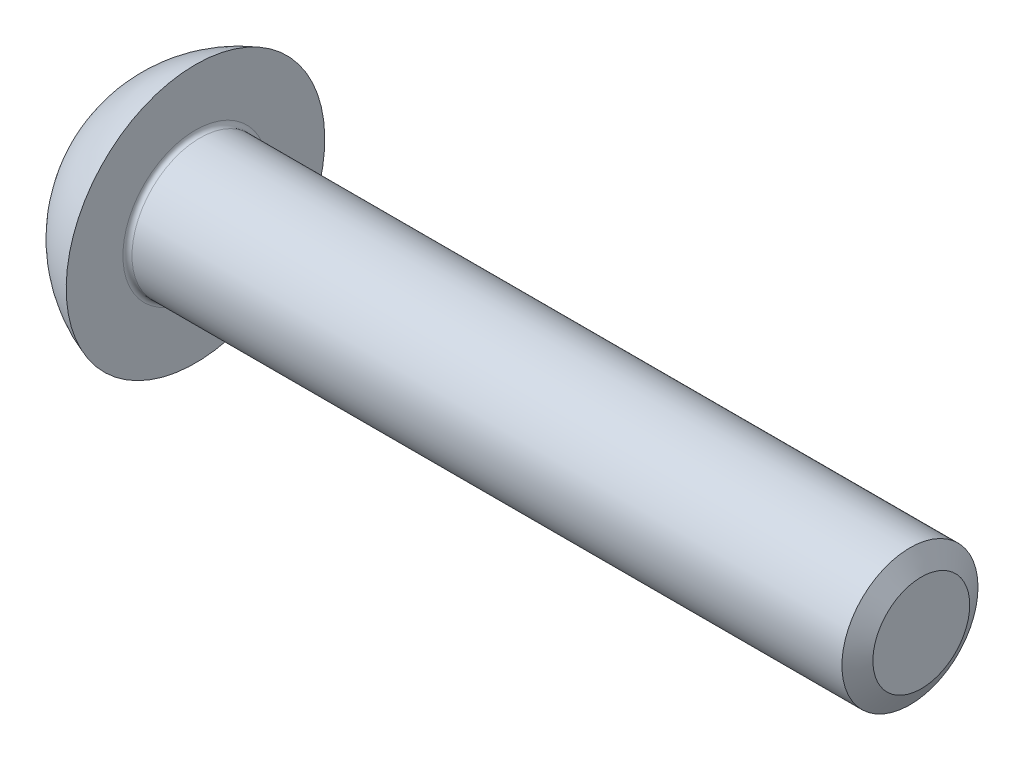
ISO-10303-21;
HEADER;
FILE_DESCRIPTION(('STEP AP214'),'2;1');
FILE_NAME('part.step','',(''),(''),'','','');
FILE_SCHEMA(('AUTOMOTIVE_DESIGN { 1 0 10303 214 1 1 1 1 }'));
ENDSEC;
DATA;
#1=APPLICATION_CONTEXT('core data for automotive mechanical design processes');
#2=APPLICATION_PROTOCOL_DEFINITION('international standard','automotive_design',2000,#1);
#3=PRODUCT_CONTEXT('',#1,'mechanical');
#4=PRODUCT('Part','Part','',(#3));
#5=PRODUCT_RELATED_PRODUCT_CATEGORY('part','',(#4));
#6=PRODUCT_DEFINITION_FORMATION('','',#4);
#7=PRODUCT_DEFINITION_CONTEXT('part definition',#1,'design');
#8=PRODUCT_DEFINITION('design','',#6,#7);
#9=PRODUCT_DEFINITION_SHAPE('','',#8);
#10=(LENGTH_UNIT() NAMED_UNIT(*) SI_UNIT(.MILLI.,.METRE.));
#11=(NAMED_UNIT(*) PLANE_ANGLE_UNIT() SI_UNIT($,.RADIAN.));
#12=(NAMED_UNIT(*) SI_UNIT($,.STERADIAN.) SOLID_ANGLE_UNIT());
#13=UNCERTAINTY_MEASURE_WITH_UNIT(LENGTH_MEASURE(1.E-05),#10,'distance_accuracy_value','');
#14=(GEOMETRIC_REPRESENTATION_CONTEXT(3) GLOBAL_UNCERTAINTY_ASSIGNED_CONTEXT((#13)) GLOBAL_UNIT_ASSIGNED_CONTEXT((#10,
#11,#12)) REPRESENTATION_CONTEXT('',''));
#15=CARTESIAN_POINT('',(0.,0.,0.));
#16=DIRECTION('',(0.,0.,1.));
#17=DIRECTION('',(1.,0.,0.));
#18=AXIS2_PLACEMENT_3D('',#15,#16,#17);
#19=CARTESIAN_POINT('',(-17.65,0.,0.));
#20=DIRECTION('',(-1.,0.,0.));
#21=DIRECTION('',(0.,0.,-1.));
#22=AXIS2_PLACEMENT_3D('',#19,#20,#21);
#23=CYLINDRICAL_SURFACE('',#22,1.5);
#24=CARTESIAN_POINT('',(-15.9,0.,0.));
#25=DIRECTION('',(1.,0.,0.));
#26=DIRECTION('',(0.,0.,-1.));
#27=AXIS2_PLACEMENT_3D('',#24,#25,#26);
#28=CIRCLE('',#27,1.5);
#29=CARTESIAN_POINT('',(-15.9,0.,-1.5));
#30=VERTEX_POINT('',#29);
#31=EDGE_CURVE('E185',#30,#30,#28,.T.);
#32=ORIENTED_EDGE('',*,*,#31,.T.);
#33=EDGE_LOOP('',(#32));
#34=FACE_BOUND('',#33,.T.);
#35=CARTESIAN_POINT('',(-0.25,0.,0.));
#36=DIRECTION('',(1.,0.,0.));
#37=DIRECTION('',(0.,0.,-1.));
#38=AXIS2_PLACEMENT_3D('',#35,#36,#37);
#39=CIRCLE('',#38,1.5);
#40=CARTESIAN_POINT('',(-0.25,0.,-1.5));
#41=VERTEX_POINT('',#40);
#42=EDGE_CURVE('E458',#41,#41,#39,.T.);
#43=ORIENTED_EDGE('',*,*,#42,.F.);
#44=EDGE_LOOP('',(#43));
#45=FACE_BOUND('',#44,.T.);
#46=ADVANCED_FACE('F43',(#34,#45),#23,.T.);
#47=CARTESIAN_POINT('',(-17.65,0.,0.));
#48=DIRECTION('',(1.,0.,0.));
#49=DIRECTION('',(0.,0.,1.));
#50=AXIS2_PLACEMENT_3D('',#47,#48,#49);
#51=PLANE('',#50);
#52=CARTESIAN_POINT('',(-17.65,0.,0.));
#53=DIRECTION('',(1.,0.,0.));
#54=DIRECTION('',(0.,0.,-1.));
#55=AXIS2_PLACEMENT_3D('',#52,#53,#54);
#56=CIRCLE('',#55,1.5);
#57=CARTESIAN_POINT('',(-17.65,1.5,0.));
#58=VERTEX_POINT('',#57);
#59=EDGE_CURVE('E177',#58,#58,#56,.T.);
#60=ORIENTED_EDGE('',*,*,#59,.F.);
#61=EDGE_LOOP('',(#60));
#62=FACE_BOUND('',#61,.T.);
#63=CARTESIAN_POINT('',(-17.65,0.,0.));
#64=DIRECTION('',(-1.,0.,0.));
#65=DIRECTION('',(0.,0.,1.));
#66=AXIS2_PLACEMENT_3D('',#63,#64,#65);
#67=CIRCLE('',#66,1.15470053837925);
#68=CARTESIAN_POINT('',(-17.65,-0.577350269189627,1.));
#69=VERTEX_POINT('',#68);
#70=CARTESIAN_POINT('',(-17.65,-1.15470053837925,0.));
#71=VERTEX_POINT('',#70);
#72=EDGE_CURVE('E11',#69,#71,#67,.F.);
#73=ORIENTED_EDGE('',*,*,#72,.T.);
#74=CARTESIAN_POINT('',(-17.65,-0.577350269189633,-0.999999999999999));
#75=VERTEX_POINT('',#74);
#76=EDGE_CURVE('E52',#71,#75,#67,.F.);
#77=ORIENTED_EDGE('',*,*,#76,.T.);
#78=CARTESIAN_POINT('',(-17.65,0.577350269189629,-1.));
#79=VERTEX_POINT('',#78);
#80=EDGE_CURVE('E294',#75,#79,#67,.F.);
#81=ORIENTED_EDGE('',*,*,#80,.T.);
#82=CARTESIAN_POINT('',(-17.65,0.,0.));
#83=DIRECTION('',(1.,0.,0.));
#84=DIRECTION('',(0.,0.,-1.));
#85=AXIS2_PLACEMENT_3D('',#82,#83,#84);
#86=CIRCLE('',#85,1.15470053837925);
#87=CARTESIAN_POINT('',(-17.65,1.15470053837925,0.));
#88=VERTEX_POINT('',#87);
#89=EDGE_CURVE('E212',#79,#88,#86,.T.);
#90=ORIENTED_EDGE('',*,*,#89,.T.);
#91=CARTESIAN_POINT('',(-17.65,0.577350269189628,1.));
#92=VERTEX_POINT('',#91);
#93=EDGE_CURVE('E128',#88,#92,#67,.F.);
#94=ORIENTED_EDGE('',*,*,#93,.T.);
#95=EDGE_CURVE('E47',#92,#69,#67,.F.);
#96=ORIENTED_EDGE('',*,*,#95,.T.);
#97=EDGE_LOOP('',(#73,#77,#81,#90,#94,#96));
#98=FACE_BOUND('',#97,.T.);
#99=ADVANCED_FACE('F45',(#62,#98),#51,.F.);
#100=CARTESIAN_POINT('',(-15.0454545454545,0.,0.));
#101=DIRECTION('',(-1.,0.,0.));
#102=DIRECTION('',(0.,1.,0.));
#103=AXIS2_PLACEMENT_3D('',#100,#101,#102);
#104=SPHERICAL_SURFACE('',#103,3.00560426949281);
#105=CARTESIAN_POINT('',(-16.,0.,0.));
#106=DIRECTION('',(1.,0.,0.));
#107=DIRECTION('',(0.,0.,-1.));
#108=AXIS2_PLACEMENT_3D('',#105,#106,#107);
#109=CIRCLE('',#108,2.85);
#110=CARTESIAN_POINT('',(-16.,2.85,0.));
#111=VERTEX_POINT('',#110);
#112=EDGE_CURVE('E180',#111,#111,#109,.T.);
#113=CARTESIAN_POINT('',(-17.65,1.5,0.));
#114=CARTESIAN_POINT('',(-17.6386705331495,1.51967216925547,0.));
#115=CARTESIAN_POINT('',(-17.6271181108235,1.53921593268643,0.));
#116=CARTESIAN_POINT('',(-17.6035734644196,1.57803672196104,0.));
#117=CARTESIAN_POINT('',(-17.5915812403415,1.59731374780468,0.));
#118=CARTESIAN_POINT('',(-17.5671630996322,1.6355911359664,0.));
#119=CARTESIAN_POINT('',(-17.554737183001,1.65459149828446,0.));
#120=CARTESIAN_POINT('',(-17.5294580495481,1.69230581219271,0.));
#121=CARTESIAN_POINT('',(-17.5166048327265,1.71101976378289,0.));
#122=CARTESIAN_POINT('',(-17.4904776944242,1.74815164624667,0.));
#123=CARTESIAN_POINT('',(-17.4772037729434,1.76656957712026,0.));
#124=CARTESIAN_POINT('',(-17.4502420411911,1.8030999627764,0.));
#125=CARTESIAN_POINT('',(-17.4365542309196,1.82121241755894,0.));
#126=CARTESIAN_POINT('',(-17.4087717487848,1.85712255178676,0.));
#127=CARTESIAN_POINT('',(-17.3946770769215,1.87492023123203,0.));
#128=CARTESIAN_POINT('',(-17.366088108,1.91019167733672,0.));
#129=CARTESIAN_POINT('',(-17.3515938109419,1.92766544399613,0.));
#130=CARTESIAN_POINT('',(-17.3222130331156,1.96228009332959,0.));
#131=CARTESIAN_POINT('',(-17.3073265523475,1.97942097600362,0.));
#132=CARTESIAN_POINT('',(-17.2771690499588,2.01336105708599,0.));
#133=CARTESIAN_POINT('',(-17.2618980283382,2.03016025549433,0.));
#134=CARTESIAN_POINT('',(-17.2309792845233,2.06340834318511,0.));
#135=CARTESIAN_POINT('',(-17.2153315623289,2.07985723246755,0.));
#136=CARTESIAN_POINT('',(-17.1836674510477,2.1123962568992,0.));
#137=CARTESIAN_POINT('',(-17.1676510619609,2.12848639204841,0.));
#138=CARTESIAN_POINT('',(-17.1352578398529,2.16029964739354,0.));
#139=CARTESIAN_POINT('',(-17.1188810068317,2.17602276758948,0.));
#140=CARTESIAN_POINT('',(-17.0857753048683,2.2070939206369,0.));
#141=CARTESIAN_POINT('',(-17.069046435926,2.22244195348838,0.));
#142=CARTESIAN_POINT('',(-17.0352452508718,2.25275505202893,0.));
#143=CARTESIAN_POINT('',(-17.01817293476,2.26772011771798,0.));
#144=CARTESIAN_POINT('',(-16.9836936204474,2.29725959873447,0.));
#145=CARTESIAN_POINT('',(-16.9662866222466,2.3118340140619,0.));
#146=CARTESIAN_POINT('',(-16.9311468806653,2.34058471171934,0.));
#147=CARTESIAN_POINT('',(-16.9134141372848,2.35476099404935,0.));
#148=CARTESIAN_POINT('',(-16.8776320094939,2.38270814748122,0.));
#149=CARTESIAN_POINT('',(-16.8595826250834,2.39647901858308,0.));
#150=CARTESIAN_POINT('',(-16.8231764819488,2.42360827946967,0.));
#151=CARTESIAN_POINT('',(-16.8048197232246,2.43696666925441,0.));
#152=CARTESIAN_POINT('',(-16.7678082559874,2.46326410918943,0.));
#153=CARTESIAN_POINT('',(-16.7491535474743,2.4762031593397,0.));
#154=CARTESIAN_POINT('',(-16.7115557581542,2.50165527698115,0.));
#155=CARTESIAN_POINT('',(-16.6926126773472,2.51416834447231,0.));
#156=CARTESIAN_POINT('',(-16.6544478689872,2.53876207247436,0.));
#157=CARTESIAN_POINT('',(-16.6352261414343,2.55084273298523,0.));
#158=CARTESIAN_POINT('',(-16.5965139081898,2.57456544470665,0.));
#159=CARTESIAN_POINT('',(-16.5770234024984,2.5862074959172,0.));
#160=CARTESIAN_POINT('',(-16.5377836195783,2.60904701190565,0.));
#161=CARTESIAN_POINT('',(-16.5180343423497,2.62024447668356,0.));
#162=CARTESIAN_POINT('',(-16.4782871558097,2.6421890709225,0.));
#163=CARTESIAN_POINT('',(-16.4582892464984,2.65293620038352,0.));
#164=CARTESIAN_POINT('',(-16.4180550629064,2.67397460633529,0.));
#165=CARTESIAN_POINT('',(-16.3978187886257,2.68426588282603,0.));
#166=CARTESIAN_POINT('',(-16.3571182645539,2.70438729913089,0.));
#167=CARTESIAN_POINT('',(-16.3366540147628,2.714217438945,0.));
#168=CARTESIAN_POINT('',(-16.2955080462974,2.73341153528513,0.));
#169=CARTESIAN_POINT('',(-16.2748263276231,2.74277549181114,0.));
#170=CARTESIAN_POINT('',(-16.2332560392077,2.7610324130256,0.));
#171=CARTESIAN_POINT('',(-16.2123674694665,2.76992537771404,0.));
#172=CARTESIAN_POINT('',(-16.1703942046549,2.78723575329491,0.));
#173=CARTESIAN_POINT('',(-16.1493095095844,2.79565316418733,0.));
#174=CARTESIAN_POINT('',(-16.1069548141172,2.81200809653372,0.));
#175=CARTESIAN_POINT('',(-16.0856848137203,2.8199456179877,0.));
#176=CARTESIAN_POINT('',(-16.0429704467276,2.83533674876495,0.));
#177=CARTESIAN_POINT('',(-16.0215260801317,2.84279035808822,0.));
#178=CARTESIAN_POINT('',(-16.,2.85,0.));
#179=B_SPLINE_CURVE_WITH_KNOTS('',3,(#113,#114,#115,#116,#117,#118,#119,#120,#121,#122,#123,
#124,#125,#126,#127,#128,#129,#130,#131,#132,#133,#134,#135,#136,#137,#138,#139,#140,#141,#142,
#143,#144,#145,#146,#147,#148,#149,#150,#151,#152,#153,#154,#155,#156,#157,#158,#159,#160,#161,
#162,#163,#164,#165,#166,#167,#168,#169,#170,#171,#172,#173,#174,#175,#176,#177,#178),
.UNSPECIFIED.,.F.,.F.,(4,2,2,2,2,2,2,2,2,2,2,2,2,2,2,2,2,2,2,2,2,2,2,2,2,2,2,2,2,2,2,2,4),(0.,
0.0681025747754081,0.136205149550819,0.204307724326227,0.272410299101637,0.340512873877048,
0.408615448652458,0.476718023427867,0.544820598203276,0.612923172978687,0.681025747754097,
0.749128322529505,0.817230897304915,0.885333472080324,0.953436046855735,1.02153862163114,
1.08964119640655,1.15774377118196,1.22584634595737,1.29394892073278,1.36205149550819,
1.4301540702836,1.49825664505901,1.56635921983442,1.63446179460983,1.70256436938524,
1.77066694416065,1.83876951893606,1.90687209371147,1.97497466848688,2.04307724326229,
2.1111798180377,2.17928239281311),.UNSPECIFIED.);
#180=EDGE_CURVE('BSEAM156',#58,#111,#179,.T.);
#181=ORIENTED_EDGE('',*,*,#59,.T.);
#182=ORIENTED_EDGE('',*,*,#112,.F.);
#183=ORIENTED_EDGE('',*,*,#180,.T.);
#184=ORIENTED_EDGE('',*,*,#180,.F.);
#185=EDGE_LOOP('',(#181,#183,#182,#184));
#186=FACE_BOUND('',#185,.T.);
#187=ADVANCED_FACE('F156',(#186),#104,.T.);
#188=CARTESIAN_POINT('',(-16.,1.6,0.));
#189=DIRECTION('',(-1.,0.,0.));
#190=DIRECTION('',(0.,0.,-1.));
#191=AXIS2_PLACEMENT_3D('',#188,#189,#190);
#192=PLANE('',#191);
#193=ORIENTED_EDGE('',*,*,#112,.T.);
#194=EDGE_LOOP('',(#193));
#195=FACE_BOUND('',#194,.T.);
#196=CARTESIAN_POINT('',(-16.,0.,0.));
#197=DIRECTION('',(1.,0.,0.));
#198=DIRECTION('',(0.,0.,-1.));
#199=AXIS2_PLACEMENT_3D('',#196,#197,#198);
#200=CIRCLE('',#199,1.6);
#201=CARTESIAN_POINT('',(-16.,0.,-1.6));
#202=VERTEX_POINT('',#201);
#203=EDGE_CURVE('E181',#202,#202,#200,.T.);
#204=ORIENTED_EDGE('',*,*,#203,.F.);
#205=EDGE_LOOP('',(#204));
#206=FACE_BOUND('',#205,.T.);
#207=ADVANCED_FACE('F166',(#195,#206),#192,.F.);
#208=CARTESIAN_POINT('',(-15.9,0.,0.));
#209=DIRECTION('',(-1.,0.,0.));
#210=DIRECTION('',(0.,0.,-1.));
#211=AXIS2_PLACEMENT_3D('',#208,#209,#210);
#212=TOROIDAL_SURFACE('',#211,1.6,0.0999999999999997);
#213=ORIENTED_EDGE('',*,*,#203,.T.);
#214=EDGE_LOOP('',(#213));
#215=FACE_BOUND('',#214,.T.);
#216=ORIENTED_EDGE('',*,*,#31,.F.);
#217=EDGE_LOOP('',(#216));
#218=FACE_BOUND('',#217,.T.);
#219=ADVANCED_FACE('F149',(#215,#218),#212,.F.);
#220=CARTESIAN_POINT('',(-17.35,0.,0.));
#221=DIRECTION('',(-1.,0.,0.));
#222=DIRECTION('',(0.,0.,-1.));
#223=AXIS2_PLACEMENT_3D('',#220,#221,#222);
#224=CONICAL_SURFACE('',#223,0.,1.31660847419538);
#225=CARTESIAN_POINT('',(-17.8201338061757,-1.5081300450323,1.));
#226=CARTESIAN_POINT('',(-17.8103550434582,-1.46296169551438,1.));
#227=CARTESIAN_POINT('',(-17.8007010634319,-1.41776633015547,1.));
#228=CARTESIAN_POINT('',(-17.7817057249496,-1.32730802004725,1.));
#229=CARTESIAN_POINT('',(-17.7723643798043,-1.28204507250605,1.));
#230=CARTESIAN_POINT('',(-17.744887707109,-1.1460540932135,1.));
#231=CARTESIAN_POINT('',(-17.727318593487,-1.05520983554783,1.));
#232=CARTESIAN_POINT('',(-17.6946113120355,-0.873838301527069,1.));
#233=CARTESIAN_POINT('',(-17.6794545669183,-0.783314439111169,1.));
#234=CARTESIAN_POINT('',(-17.6526000869216,-0.601754544937859,1.));
#235=CARTESIAN_POINT('',(-17.6409016960468,-0.510718613654572,1.));
#236=CARTESIAN_POINT('',(-17.6224688104588,-0.327147289363391,1.));
#237=CARTESIAN_POINT('',(-17.615787761882,-0.23460619153087,1.));
#238=CARTESIAN_POINT('',(-17.6090368362792,-0.0493046546038947,1.));
#239=CARTESIAN_POINT('',(-17.6089640024594,0.0434556678202297,1.));
#240=CARTESIAN_POINT('',(-17.6154534933963,0.229083736297403,1.));
#241=CARTESIAN_POINT('',(-17.6220414736928,0.321950510989406,1.));
#242=CARTESIAN_POINT('',(-17.6404572139866,0.507192547661315,1.));
#243=CARTESIAN_POINT('',(-17.6522884816114,0.599567438647759,1.));
#244=CARTESIAN_POINT('',(-17.6798118313046,0.785811374344468,1.));
#245=CARTESIAN_POINT('',(-17.6955836030667,0.87966821099882,1.));
#246=CARTESIAN_POINT('',(-17.7295232966728,1.06695285350417,1.));
#247=CARTESIAN_POINT('',(-17.7476915787193,1.16038059267177,1.));
#248=CARTESIAN_POINT('',(-17.7855853163011,1.34694314919725,1.));
#249=CARTESIAN_POINT('',(-17.8053112029702,1.44007787798178,1.));
#250=CARTESIAN_POINT('',(-17.8457971322914,1.62612272763755,1.));
#251=CARTESIAN_POINT('',(-17.866557196056,1.71903284388273,1.));
#252=CARTESIAN_POINT('',(-17.9085485742601,1.90363742744431,1.));
#253=CARTESIAN_POINT('',(-17.9297718689088,1.99533372655925,1.));
#254=CARTESIAN_POINT('',(-17.9727143057913,2.17861191601366,1.));
#255=CARTESIAN_POINT('',(-17.9944334585808,2.27019380387372,1.));
#256=CARTESIAN_POINT('',(-18.0382042420233,2.45314970796373,1.));
#257=CARTESIAN_POINT('',(-18.0602553943374,2.54452383886908,1.));
#258=CARTESIAN_POINT('',(-18.1046332471854,2.72720190599483,1.));
#259=CARTESIAN_POINT('',(-18.1269599382911,2.8185058445041,1.));
#260=CARTESIAN_POINT('',(-18.1493826695211,2.9097859214388,1.));
#261=B_SPLINE_CURVE_WITH_KNOTS('',3,(#225,#226,#227,#228,#229,#230,#231,#232,#233,#234,#235,
#236,#237,#238,#239,#240,#241,#242,#243,#244,#245,#246,#247,#248,#249,#250,#251,#252,#253,#254,
#255,#256,#257,#258,#259,#260),.UNSPECIFIED.,.F.,.F.,(4,2,2,2,2,2,2,2,2,2,2,2,2,2,2,2,2,4),(0.,
0.138643869889783,0.277293635233151,0.554857004517541,0.830167022781704,1.10542478551794,
1.38357462934897,1.66160001660695,1.94070037269331,2.21998772241579,2.50545939030144,
2.79097401441239,3.07656794584651,3.36216771000261,3.64452690710852,3.92689212062334,
4.20888343548738,4.49086512790397),.UNSPECIFIED.);
#262=EDGE_CURVE('E105',#69,#92,#261,.T.);
#263=ORIENTED_EDGE('',*,*,#262,.F.);
#264=ORIENTED_EDGE('',*,*,#95,.F.);
#265=EDGE_LOOP('',(#263,#264));
#266=FACE_BOUND('',#265,.T.);
#267=ADVANCED_FACE('F120',(#266),#224,.F.);
#268=CARTESIAN_POINT('',(-17.6500300044995,0.57723479913579,1.0002));
#269=CARTESIAN_POINT('',(-17.6437929192042,0.601225021738601,0.958647715567044));
#270=CARTESIAN_POINT('',(-17.6381313786167,0.625256195021443,0.917024502475672));
#271=CARTESIAN_POINT('',(-17.6281854217223,0.673398386330441,0.833639781140785));
#272=CARTESIAN_POINT('',(-17.6239015302713,0.697509431260086,0.791878226299064));
#273=CARTESIAN_POINT('',(-17.6169589031667,0.745673772514857,0.708455140132715));
#274=CARTESIAN_POINT('',(-17.6142923745456,0.769726780462719,0.66679410829216));
#275=CARTESIAN_POINT('',(-17.6107168929941,0.817861664223351,0.583422044002323));
#276=CARTESIAN_POINT('',(-17.6098076211353,0.841943534003896,0.541711022001162));
#277=CARTESIAN_POINT('',(-17.6098076211353,0.890107273564986,0.458288977998839));
#278=CARTESIAN_POINT('',(-17.6107168929941,0.914189143345531,0.416577955997678));
#279=CARTESIAN_POINT('',(-17.6142923745456,0.962324027106163,0.333205891707841));
#280=CARTESIAN_POINT('',(-17.6169589031667,0.986377035054025,0.291544859867286));
#281=CARTESIAN_POINT('',(-17.6239015302713,1.0345413763088,0.208121773700937));
#282=CARTESIAN_POINT('',(-17.6281854217223,1.05865242123844,0.166360218859216));
#283=CARTESIAN_POINT('',(-17.6381313786167,1.10679461254744,0.0829754975243296));
#284=CARTESIAN_POINT('',(-17.6437929192042,1.13082578583028,0.0413522844329569));
#285=CARTESIAN_POINT('',(-17.6500300044996,1.15481600843309,-0.000199999999998983));
#286=B_SPLINE_CURVE_WITH_KNOTS('',3,(#268,#269,#270,#271,#272,#273,#274,#275,#276,#277,#278,
#279,#280,#281,#282,#283,#284,#285),.UNSPECIFIED.,.F.,.F.,(4,2,2,2,2,2,2,2,4),(0.,
0.145159524820138,0.290374287087485,0.434883682122849,0.57936684736763,0.723850012612412,
0.868359407647777,1.01357416991512,1.15873369473526),.UNSPECIFIED.);
#287=EDGE_CURVE('E122',#92,#88,#286,.T.);
#288=ORIENTED_EDGE('',*,*,#287,.F.);
#289=ORIENTED_EDGE('',*,*,#93,.F.);
#290=EDGE_LOOP('',(#288,#289));
#291=FACE_BOUND('',#290,.T.);
#292=ADVANCED_FACE('F148',(#291),#224,.F.);
#293=CARTESIAN_POINT('',(-17.6500300044996,1.15481600843309,0.000200000000000797));
#294=CARTESIAN_POINT('',(-17.6437929192042,1.13082578583028,-0.0413522844329552));
#295=CARTESIAN_POINT('',(-17.6381313786167,1.10679461254744,-0.0829754975243279));
#296=CARTESIAN_POINT('',(-17.6281854217223,1.05865242123844,-0.166360218859215));
#297=CARTESIAN_POINT('',(-17.6239015302713,1.0345413763088,-0.208121773700935));
#298=CARTESIAN_POINT('',(-17.6169589031667,0.986377035054025,-0.291544859867285));
#299=CARTESIAN_POINT('',(-17.6142923745456,0.962324027106163,-0.33320589170784));
#300=CARTESIAN_POINT('',(-17.6107168929941,0.914189143345531,-0.416577955997676));
#301=CARTESIAN_POINT('',(-17.6098076211353,0.890107273564986,-0.458288977998838));
#302=CARTESIAN_POINT('',(-17.6098076211353,0.841943534003896,-0.541711022001161));
#303=CARTESIAN_POINT('',(-17.6107168929941,0.817861664223351,-0.583422044002322));
#304=CARTESIAN_POINT('',(-17.6142923745456,0.769726780462719,-0.666794108292158));
#305=CARTESIAN_POINT('',(-17.6169589031667,0.745673772514857,-0.708455140132713));
#306=CARTESIAN_POINT('',(-17.6239015302713,0.697509431260086,-0.791878226299063));
#307=CARTESIAN_POINT('',(-17.6281854217223,0.673398386330441,-0.833639781140783));
#308=CARTESIAN_POINT('',(-17.6381313786167,0.625256195021442,-0.91702450247567));
#309=CARTESIAN_POINT('',(-17.6437929192042,0.601225021738601,-0.958647715567043));
#310=CARTESIAN_POINT('',(-17.6500300044995,0.57723479913579,-1.0002));
#311=B_SPLINE_CURVE_WITH_KNOTS('',3,(#293,#294,#295,#296,#297,#298,#299,#300,#301,#302,#303,
#304,#305,#306,#307,#308,#309,#310),.UNSPECIFIED.,.F.,.F.,(4,2,2,2,2,2,2,2,4),(0.,
0.145159524820137,0.290374287087485,0.43488368212285,0.579366847367631,0.723850012612412,
0.868359407647777,1.01357416991512,1.15873369473526),.UNSPECIFIED.);
#312=EDGE_CURVE('E277',#88,#79,#311,.T.);
#313=ORIENTED_EDGE('',*,*,#312,.F.);
#314=ORIENTED_EDGE('',*,*,#89,.F.);
#315=EDGE_LOOP('',(#313,#314));
#316=FACE_BOUND('',#315,.T.);
#317=ADVANCED_FACE('F144',(#316),#224,.F.);
#318=CARTESIAN_POINT('',(-17.8201338061757,-1.5081300450323,-0.999999999999999));
#319=CARTESIAN_POINT('',(-17.8103550434582,-1.46296169551439,-0.999999999999999));
#320=CARTESIAN_POINT('',(-17.8007010634319,-1.41776633015547,-0.999999999999999));
#321=CARTESIAN_POINT('',(-17.7817057249496,-1.32730802004725,-0.999999999999999));
#322=CARTESIAN_POINT('',(-17.7723643798043,-1.28204507250605,-0.999999999999999));
#323=CARTESIAN_POINT('',(-17.744887707109,-1.1460540932135,-0.999999999999999));
#324=CARTESIAN_POINT('',(-17.727318593487,-1.05520983554783,-0.999999999999999));
#325=CARTESIAN_POINT('',(-17.6946113120355,-0.87383830152707,-0.999999999999999));
#326=CARTESIAN_POINT('',(-17.6794545669183,-0.78331443911117,-0.999999999999999));
#327=CARTESIAN_POINT('',(-17.6526000869216,-0.601754544937859,-0.999999999999999));
#328=CARTESIAN_POINT('',(-17.6409016960468,-0.510718613654572,-0.999999999999999));
#329=CARTESIAN_POINT('',(-17.6224688104588,-0.327147289363391,-0.999999999999999));
#330=CARTESIAN_POINT('',(-17.615787761882,-0.23460619153087,-0.999999999999999));
#331=CARTESIAN_POINT('',(-17.6090368362792,-0.049304654603895,-0.999999999999999));
#332=CARTESIAN_POINT('',(-17.6089640024594,0.0434556678202295,-0.999999999999999));
#333=CARTESIAN_POINT('',(-17.6154534933963,0.229083736297403,-0.999999999999999));
#334=CARTESIAN_POINT('',(-17.6220414736928,0.321950510989406,-0.999999999999999));
#335=CARTESIAN_POINT('',(-17.6404572139866,0.507192547661315,-0.999999999999999));
#336=CARTESIAN_POINT('',(-17.6522884816114,0.599567438647759,-0.999999999999999));
#337=CARTESIAN_POINT('',(-17.6798118313046,0.785811374344468,-0.999999999999999));
#338=CARTESIAN_POINT('',(-17.6955836030667,0.879668210998819,-0.999999999999999));
#339=CARTESIAN_POINT('',(-17.7295232966728,1.06695285350416,-0.999999999999999));
#340=CARTESIAN_POINT('',(-17.7476915787193,1.16038059267177,-0.999999999999999));
#341=CARTESIAN_POINT('',(-17.7855853163011,1.34694314919725,-0.999999999999999));
#342=CARTESIAN_POINT('',(-17.8053112029702,1.44007787798178,-0.999999999999999));
#343=CARTESIAN_POINT('',(-17.8457971322914,1.62612272763755,-0.999999999999999));
#344=CARTESIAN_POINT('',(-17.866557196056,1.71903284388273,-0.999999999999999));
#345=CARTESIAN_POINT('',(-17.9085485742601,1.90363742744431,-0.999999999999999));
#346=CARTESIAN_POINT('',(-17.9297718689088,1.99533372655925,-0.999999999999999));
#347=CARTESIAN_POINT('',(-17.9727143057913,2.17861191601366,-0.999999999999999));
#348=CARTESIAN_POINT('',(-17.9944334585808,2.27019380387372,-0.999999999999999));
#349=CARTESIAN_POINT('',(-18.0382042420233,2.45314970796373,-0.999999999999999));
#350=CARTESIAN_POINT('',(-18.0602553943374,2.54452383886908,-0.999999999999999));
#351=CARTESIAN_POINT('',(-18.1046332471854,2.72720190599483,-0.999999999999999));
#352=CARTESIAN_POINT('',(-18.1269599382911,2.81850584450411,-0.999999999999999));
#353=CARTESIAN_POINT('',(-18.1493826695211,2.9097859214388,-0.999999999999999));
#354=B_SPLINE_CURVE_WITH_KNOTS('',3,(#318,#319,#320,#321,#322,#323,#324,#325,#326,#327,#328,
#329,#330,#331,#332,#333,#334,#335,#336,#337,#338,#339,#340,#341,#342,#343,#344,#345,#346,#347,
#348,#349,#350,#351,#352,#353),.UNSPECIFIED.,.F.,.F.,(4,2,2,2,2,2,2,2,2,2,2,2,2,2,2,2,2,4),(0.,
0.138643869889783,0.277293635233152,0.554857004517542,0.830167022781704,1.10542478551794,
1.38357462934897,1.66160001660695,1.94070037269331,2.21998772241579,2.50545939030144,
2.79097401441239,3.07656794584651,3.36216771000261,3.64452690710852,3.92689212062334,
4.20888343548738,4.49086512790397),.UNSPECIFIED.);
#355=EDGE_CURVE('E271',#79,#75,#354,.F.);
#356=ORIENTED_EDGE('',*,*,#355,.F.);
#357=ORIENTED_EDGE('',*,*,#80,.F.);
#358=EDGE_LOOP('',(#356,#357));
#359=FACE_BOUND('',#358,.T.);
#360=ADVANCED_FACE('F142',(#359),#224,.F.);
#361=CARTESIAN_POINT('',(-17.6500300044995,-0.577234799135789,-1.0002));
#362=CARTESIAN_POINT('',(-17.6437929192042,-0.6012250217386,-0.958647715567043));
#363=CARTESIAN_POINT('',(-17.6381313786167,-0.625256195021441,-0.91702450247567));
#364=CARTESIAN_POINT('',(-17.6281854217223,-0.67339838633044,-0.833639781140783));
#365=CARTESIAN_POINT('',(-17.6239015302713,-0.697509431260085,-0.791878226299063));
#366=CARTESIAN_POINT('',(-17.6169589031667,-0.745673772514856,-0.708455140132713));
#367=CARTESIAN_POINT('',(-17.6142923745456,-0.769726780462718,-0.666794108292158));
#368=CARTESIAN_POINT('',(-17.6107168929941,-0.81786166422335,-0.583422044002322));
#369=CARTESIAN_POINT('',(-17.6098076211353,-0.841943534003895,-0.54171102200116));
#370=CARTESIAN_POINT('',(-17.6098076211353,-0.890107273564985,-0.458288977998838));
#371=CARTESIAN_POINT('',(-17.6107168929941,-0.914189143345529,-0.416577955997676));
#372=CARTESIAN_POINT('',(-17.6142923745456,-0.962324027106161,-0.33320589170784));
#373=CARTESIAN_POINT('',(-17.6169589031667,-0.986377035054023,-0.291544859867285));
#374=CARTESIAN_POINT('',(-17.6239015302713,-1.03454137630879,-0.208121773700935));
#375=CARTESIAN_POINT('',(-17.6281854217223,-1.05865242123844,-0.166360218859215));
#376=CARTESIAN_POINT('',(-17.6381313786167,-1.10679461254744,-0.0829754975243279));
#377=CARTESIAN_POINT('',(-17.6437929192042,-1.13082578583028,-0.0413522844329551));
#378=CARTESIAN_POINT('',(-17.6500300044995,-1.15481600843309,0.000200000000000986));
#379=B_SPLINE_CURVE_WITH_KNOTS('',3,(#361,#362,#363,#364,#365,#366,#367,#368,#369,#370,#371,
#372,#373,#374,#375,#376,#377,#378),.UNSPECIFIED.,.F.,.F.,(4,2,2,2,2,2,2,2,4),(0.,
0.145159524820138,0.290374287087485,0.434883682122849,0.57936684736763,0.723850012612411,
0.868359407647776,1.01357416991512,1.15873369473526),.UNSPECIFIED.);
#380=EDGE_CURVE('E116',#75,#71,#379,.T.);
#381=ORIENTED_EDGE('',*,*,#380,.F.);
#382=ORIENTED_EDGE('',*,*,#76,.F.);
#383=EDGE_LOOP('',(#381,#382));
#384=FACE_BOUND('',#383,.T.);
#385=ADVANCED_FACE('F133',(#384),#224,.F.);
#386=CARTESIAN_POINT('',(-17.6500300044995,-1.15481600843309,-0.0001999999999991));
#387=CARTESIAN_POINT('',(-17.6437929192042,-1.13082578583028,0.0413522844329571));
#388=CARTESIAN_POINT('',(-17.6381313786167,-1.10679461254744,0.0829754975243299));
#389=CARTESIAN_POINT('',(-17.6281854217223,-1.05865242123844,0.166360218859217));
#390=CARTESIAN_POINT('',(-17.6239015302713,-1.03454137630879,0.208121773700937));
#391=CARTESIAN_POINT('',(-17.6169589031667,-0.986377035054023,0.291544859867287));
#392=CARTESIAN_POINT('',(-17.6142923745456,-0.962324027106161,0.333205891707842));
#393=CARTESIAN_POINT('',(-17.6107168929941,-0.914189143345529,0.416577955997678));
#394=CARTESIAN_POINT('',(-17.6098076211353,-0.890107273564984,0.458288977998839));
#395=CARTESIAN_POINT('',(-17.6098076211353,-0.841943534003895,0.541711022001162));
#396=CARTESIAN_POINT('',(-17.6107168929941,-0.81786166422335,0.583422044002323));
#397=CARTESIAN_POINT('',(-17.6142923745456,-0.769726780462718,0.66679410829216));
#398=CARTESIAN_POINT('',(-17.6169589031667,-0.745673772514856,0.708455140132715));
#399=CARTESIAN_POINT('',(-17.6239015302713,-0.697509431260084,0.791878226299065));
#400=CARTESIAN_POINT('',(-17.6281854217223,-0.67339838633044,0.833639781140785));
#401=CARTESIAN_POINT('',(-17.6381313786167,-0.625256195021441,0.917024502475672));
#402=CARTESIAN_POINT('',(-17.6437929192042,-0.6012250217386,0.958647715567044));
#403=CARTESIAN_POINT('',(-17.6500300044995,-0.577234799135788,1.0002));
#404=B_SPLINE_CURVE_WITH_KNOTS('',3,(#386,#387,#388,#389,#390,#391,#392,#393,#394,#395,#396,
#397,#398,#399,#400,#401,#402,#403),.UNSPECIFIED.,.F.,.F.,(4,2,2,2,2,2,2,2,4),(0.,
0.145159524820137,0.290374287087485,0.43488368212285,0.579366847367631,0.723850012612411,
0.868359407647776,1.01357416991512,1.15873369473526),.UNSPECIFIED.);
#405=EDGE_CURVE('E112',#71,#69,#404,.T.);
#406=ORIENTED_EDGE('',*,*,#405,.F.);
#407=ORIENTED_EDGE('',*,*,#72,.F.);
#408=EDGE_LOOP('',(#406,#407));
#409=FACE_BOUND('',#408,.T.);
#410=ADVANCED_FACE('F130',(#409),#224,.F.);
#411=CARTESIAN_POINT('',(-16.61,0.,0.));
#412=DIRECTION('',(-1.,0.,0.));
#413=DIRECTION('',(0.,0.,-1.));
#414=AXIS2_PLACEMENT_3D('',#411,#412,#413);
#415=CONICAL_SURFACE('',#414,1.15470053837925,1.08478502970568);
#416=CARTESIAN_POINT('',(-16.,0.,0.));
#417=VERTEX_POINT('',#416);
#418=VERTEX_LOOP('',#417);
#419=FACE_BOUND('',#418,.T.);
#420=CARTESIAN_POINT('',(-16.9533777683403,-1.50230992873525,-0.999999999999999));
#421=CARTESIAN_POINT('',(-16.9340444769777,-1.45833854185076,-0.999999999999999));
#422=CARTESIAN_POINT('',(-16.9149232467738,-1.41427434344668,-0.999999999999999));
#423=CARTESIAN_POINT('',(-16.8772163059513,-1.32590919920825,-0.999999999999999));
#424=CARTESIAN_POINT('',(-16.8586306830292,-1.28160821599644,-0.999999999999999));
#425=CARTESIAN_POINT('',(-16.8036681478386,-1.14784319726152,-0.999999999999999));
#426=CARTESIAN_POINT('',(-16.7682844804861,-1.05796321251932,-0.999999999999999));
#427=CARTESIAN_POINT('',(-16.7014887265583,-0.87612343816072,-0.999999999999999));
#428=CARTESIAN_POINT('',(-16.670100993813,-0.784154578942249,-0.999999999999999));
#429=CARTESIAN_POINT('',(-16.6142698926597,-0.598229842457831,-0.999999999999999));
#430=CARTESIAN_POINT('',(-16.5898112637181,-0.504278829186387,-0.999999999999999));
#431=CARTESIAN_POINT('',(-16.561284211292,-0.361662527207036,-0.999999999999999));
#432=CARTESIAN_POINT('',(-16.5531336537351,-0.313821896859327,-0.999999999999999));
#433=CARTESIAN_POINT('',(-16.5400901383612,-0.217683951682428,-0.999999999999999));
#434=CARTESIAN_POINT('',(-16.5351973854909,-0.169386608315469,-0.999999999999999));
#435=CARTESIAN_POINT('',(-16.5290689217004,-0.0727543492205687,-0.999999999999999));
#436=CARTESIAN_POINT('',(-16.5278181907857,-0.0244204124532985,-0.999999999999999));
#437=CARTESIAN_POINT('',(-16.5290340461929,0.0721832270827304,-0.999999999999999));
#438=CARTESIAN_POINT('',(-16.5314996115354,0.120452943848543,-0.999999999999999));
#439=CARTESIAN_POINT('',(-16.5426858199704,0.247728096968899,-0.999999999999999));
#440=CARTESIAN_POINT('',(-16.554415626327,0.326472817075769,-0.999999999999999));
#441=CARTESIAN_POINT('',(-16.5853155073204,0.482611029430832,-0.999999999999999));
#442=CARTESIAN_POINT('',(-16.6045054158237,0.560000340052674,-0.999999999999999));
#443=CARTESIAN_POINT('',(-16.6484420949321,0.714868516061646,-0.999999999999999));
#444=CARTESIAN_POINT('',(-16.6732951431871,0.792316418029709,-0.999999999999999));
#445=CARTESIAN_POINT('',(-16.7131493499715,0.907307575681683,-0.999999999999999));
#446=CARTESIAN_POINT('',(-16.7268173023165,0.945326191835167,-0.999999999999999));
#447=CARTESIAN_POINT('',(-16.7548765004687,1.02108213718649,-0.999999999999999));
#448=CARTESIAN_POINT('',(-16.7692675113704,1.05881955322302,-0.999999999999999));
#449=CARTESIAN_POINT('',(-16.783948942311,1.0964438770373,-0.999999999999999));
#450=B_SPLINE_CURVE_WITH_KNOTS('',3,(#420,#421,#422,#423,#424,#425,#426,#427,#428,#429,#430,
#431,#432,#433,#434,#435,#436,#437,#438,#439,#440,#441,#442,#443,#444,#445,#446,#447,#448,#449),
.UNSPECIFIED.,.F.,.F.,(4,2,2,2,2,2,2,2,2,2,2,2,2,2,4),(0.,0.144099688332552,0.288222837954157,
0.577934102924424,0.869334177214381,1.16008739746132,1.30558498590577,1.45109172666275,
1.59599752995897,1.74086353048645,1.97918576956973,2.21814600788026,2.46202630637785,
2.58322416173437,2.70438289404451),.UNSPECIFIED.);
#451=CARTESIAN_POINT('',(-16.61,-0.577350269189627,-0.999999999999999));
#452=VERTEX_POINT('',#451);
#453=CARTESIAN_POINT('',(-16.61,0.577350269189628,-0.999999999999999));
#454=VERTEX_POINT('',#453);
#455=EDGE_CURVE('E253',#452,#454,#450,.T.);
#456=ORIENTED_EDGE('',*,*,#455,.F.);
#457=CARTESIAN_POINT('',(-16.6100610091491,-1.15481600843309,0.000200000000000695));
#458=CARTESIAN_POINT('',(-16.5967471675624,-1.12962940463222,-0.0434244774532122));
#459=CARTESIAN_POINT('',(-16.5846484366666,-1.10426083729185,-0.0873641250019611));
#460=CARTESIAN_POINT('',(-16.5635159299897,-1.05315838414079,-0.175876170251015));
#461=CARTESIAN_POINT('',(-16.5544881451853,-1.02742388513837,-0.220449630030528));
#462=CARTESIAN_POINT('',(-16.5403368995943,-0.976221327464722,-0.309135061398768));
#463=CARTESIAN_POINT('',(-16.5351365451759,-0.950758767435701,-0.353237509059805));
#464=CARTESIAN_POINT('',(-16.5287989102245,-0.899728873053179,-0.441623878835206));
#465=CARTESIAN_POINT('',(-16.527657647587,-0.874161666034569,-0.48590758039907));
#466=CARTESIAN_POINT('',(-16.5294293203474,-0.825910520528173,-0.569481015939547));
#467=CARTESIAN_POINT('',(-16.5319054116845,-0.803222207850419,-0.608778326235426));
#468=CARTESIAN_POINT('',(-16.5399567288674,-0.757968213270524,-0.687160544093251));
#469=CARTESIAN_POINT('',(-16.5455343304689,-0.735402638782435,-0.726245265608602));
#470=CARTESIAN_POINT('',(-16.5595556697914,-0.69006577781157,-0.804771012265825));
#471=CARTESIAN_POINT('',(-16.5680513970794,-0.66729861830587,-0.844204889273722));
#472=CARTESIAN_POINT('',(-16.5874031221558,-0.62205320164348,-0.922572249742606));
#473=CARTESIAN_POINT('',(-16.5982552609432,-0.59957453503854,-0.961506442388764));
#474=CARTESIAN_POINT('',(-16.6100610091491,-0.577234799135789,-1.0002));
#475=B_SPLINE_CURVE_WITH_KNOTS('',3,(#457,#458,#459,#460,#461,#462,#463,#464,#465,#466,#467,
#468,#469,#470,#471,#472,#473,#474),.UNSPECIFIED.,.F.,.F.,(4,2,2,2,2,2,2,2,4),(0.,
0.156356652206859,0.313016607627113,0.466436255933324,0.619705352863253,0.755925705289371,
0.892250546480127,1.03114227500706,1.16980823889878),.UNSPECIFIED.);
#476=CARTESIAN_POINT('',(-16.61,-1.15470053837925,0.));
#477=VERTEX_POINT('',#476);
#478=EDGE_CURVE('E242',#477,#452,#475,.T.);
#479=ORIENTED_EDGE('',*,*,#478,.F.);
#480=CARTESIAN_POINT('',(-16.6100610091491,-0.577234799135788,1.0002));
#481=CARTESIAN_POINT('',(-16.5967471675624,-0.602421402936658,0.956575522546788));
#482=CARTESIAN_POINT('',(-16.5846484366666,-0.627789970277025,0.912635874998039));
#483=CARTESIAN_POINT('',(-16.5635159299897,-0.678892423428091,0.824123829748985));
#484=CARTESIAN_POINT('',(-16.5544881451853,-0.704626922430506,0.779550369969472));
#485=CARTESIAN_POINT('',(-16.5403368995943,-0.755829480104157,0.690864938601233));
#486=CARTESIAN_POINT('',(-16.5351365451759,-0.781292040133178,0.646762490940195));
#487=CARTESIAN_POINT('',(-16.5287989102245,-0.8323219345157,0.558376121164794));
#488=CARTESIAN_POINT('',(-16.527657647587,-0.85788914153431,0.51409241960093));
#489=CARTESIAN_POINT('',(-16.5294293203474,-0.906140287040706,0.430518984060453));
#490=CARTESIAN_POINT('',(-16.5319054116845,-0.92882859971846,0.391221673764574));
#491=CARTESIAN_POINT('',(-16.5399567288674,-0.974082594298355,0.312839455906749));
#492=CARTESIAN_POINT('',(-16.5455343304689,-0.996648168786445,0.273754734391398));
#493=CARTESIAN_POINT('',(-16.5595556697914,-1.04198502975731,0.195228987734175));
#494=CARTESIAN_POINT('',(-16.5680513970794,-1.06475218926301,0.155795110726278));
#495=CARTESIAN_POINT('',(-16.5874031221558,-1.1099976059254,0.0774277502573938));
#496=CARTESIAN_POINT('',(-16.5982552609432,-1.13247627253034,0.0384935576112364));
#497=CARTESIAN_POINT('',(-16.6100610091491,-1.15481600843309,-0.000199999999998944));
#498=B_SPLINE_CURVE_WITH_KNOTS('',3,(#480,#481,#482,#483,#484,#485,#486,#487,#488,#489,#490,
#491,#492,#493,#494,#495,#496,#497),.UNSPECIFIED.,.F.,.F.,(4,2,2,2,2,2,2,2,4),(0.,
0.156356652206859,0.313016607627112,0.466436255933324,0.619705352863253,0.755925705289371,
0.892250546480128,1.03114227500706,1.16980823889878),.UNSPECIFIED.);
#499=CARTESIAN_POINT('',(-16.61,-0.577350269189626,1.));
#500=VERTEX_POINT('',#499);
#501=EDGE_CURVE('E235',#500,#477,#498,.T.);
#502=ORIENTED_EDGE('',*,*,#501,.F.);
#503=CARTESIAN_POINT('',(-16.9533777683403,-1.50230992873526,1.));
#504=CARTESIAN_POINT('',(-16.9340444769777,-1.45833854185077,1.));
#505=CARTESIAN_POINT('',(-16.9149232467738,-1.41427434344668,1.));
#506=CARTESIAN_POINT('',(-16.8772163059513,-1.32590919920826,1.));
#507=CARTESIAN_POINT('',(-16.8586306830292,-1.28160821599644,1.));
#508=CARTESIAN_POINT('',(-16.8036681478386,-1.14784319726152,1.));
#509=CARTESIAN_POINT('',(-16.7682844804861,-1.05796321251933,1.));
#510=CARTESIAN_POINT('',(-16.7014887265583,-0.876123438160724,1.));
#511=CARTESIAN_POINT('',(-16.670100993813,-0.784154578942253,1.));
#512=CARTESIAN_POINT('',(-16.6142698926597,-0.598229842457834,1.));
#513=CARTESIAN_POINT('',(-16.5898112637181,-0.504278829186389,1.));
#514=CARTESIAN_POINT('',(-16.561284211292,-0.361662527207036,1.));
#515=CARTESIAN_POINT('',(-16.5531336537352,-0.313821896859327,1.));
#516=CARTESIAN_POINT('',(-16.5400901383612,-0.217683951682427,1.));
#517=CARTESIAN_POINT('',(-16.5351973854909,-0.169386608315468,1.));
#518=CARTESIAN_POINT('',(-16.5290689217004,-0.0727543492205665,1.));
#519=CARTESIAN_POINT('',(-16.5278181907857,-0.0244204124532958,1.));
#520=CARTESIAN_POINT('',(-16.5290340461929,0.0721832270827341,1.));
#521=CARTESIAN_POINT('',(-16.5314996115354,0.120452943848547,1.));
#522=CARTESIAN_POINT('',(-16.5426858199704,0.247728096968904,1.));
#523=CARTESIAN_POINT('',(-16.554415626327,0.326472817075775,1.));
#524=CARTESIAN_POINT('',(-16.5853155073205,0.482611029430838,1.));
#525=CARTESIAN_POINT('',(-16.6045054158237,0.560000340052681,1.));
#526=CARTESIAN_POINT('',(-16.6484420949321,0.714868516061653,1.));
#527=CARTESIAN_POINT('',(-16.6732951431871,0.792316418029717,1.));
#528=CARTESIAN_POINT('',(-16.7131493499715,0.907307575681691,1.));
#529=CARTESIAN_POINT('',(-16.7268173023165,0.945326191835176,1.));
#530=CARTESIAN_POINT('',(-16.7548765004687,1.0210821371865,1.));
#531=CARTESIAN_POINT('',(-16.7692675113704,1.05881955322303,1.));
#532=CARTESIAN_POINT('',(-16.783948942311,1.09644387703731,1.));
#533=B_SPLINE_CURVE_WITH_KNOTS('',3,(#503,#504,#505,#506,#507,#508,#509,#510,#511,#512,#513,
#514,#515,#516,#517,#518,#519,#520,#521,#522,#523,#524,#525,#526,#527,#528,#529,#530,#531,#532),
.UNSPECIFIED.,.F.,.F.,(4,2,2,2,2,2,2,2,2,2,2,2,2,2,4),(0.,0.144099688332556,0.288222837954162,
0.577934102924428,0.869334177214384,1.16008739746132,1.30558498590577,1.45109172666276,
1.59599752995898,1.74086353048646,1.97918576956974,2.21814600788028,2.46202630637787,
2.58322416173438,2.70438289404453),.UNSPECIFIED.);
#534=CARTESIAN_POINT('',(-16.61,0.577350269189628,1.));
#535=VERTEX_POINT('',#534);
#536=EDGE_CURVE('E108',#535,#500,#533,.F.);
#537=ORIENTED_EDGE('',*,*,#536,.F.);
#538=CARTESIAN_POINT('',(-16.6100610091491,1.15481600843309,-0.000199999999998803));
#539=CARTESIAN_POINT('',(-16.5967471675624,1.12962940463222,0.0434244774532139));
#540=CARTESIAN_POINT('',(-16.5846484366666,1.10426083729186,0.0873641250019628));
#541=CARTESIAN_POINT('',(-16.5635159299897,1.05315838414079,0.175876170251017));
#542=CARTESIAN_POINT('',(-16.5544881451853,1.02742388513837,0.220449630030531));
#543=CARTESIAN_POINT('',(-16.5403368995943,0.976221327464723,0.30913506139877));
#544=CARTESIAN_POINT('',(-16.5351365451759,0.950758767435702,0.353237509059808));
#545=CARTESIAN_POINT('',(-16.5287989102245,0.89972887305318,0.441623878835208));
#546=CARTESIAN_POINT('',(-16.527657647587,0.87416166603457,0.485907580399072));
#547=CARTESIAN_POINT('',(-16.5294293203474,0.825910520528174,0.569481015939549));
#548=CARTESIAN_POINT('',(-16.5319054116845,0.80322220785042,0.608778326235428));
#549=CARTESIAN_POINT('',(-16.5399567288674,0.757968213270525,0.687160544093253));
#550=CARTESIAN_POINT('',(-16.5455343304689,0.735402638782436,0.726245265608604));
#551=CARTESIAN_POINT('',(-16.5595556697914,0.690065777811572,0.804771012265827));
#552=CARTESIAN_POINT('',(-16.5680513970794,0.667298618305872,0.844204889273723));
#553=CARTESIAN_POINT('',(-16.5874031221558,0.622053201643481,0.922572249742607));
#554=CARTESIAN_POINT('',(-16.5982552609432,0.599574535038542,0.961506442388765));
#555=CARTESIAN_POINT('',(-16.6100610091491,0.57723479913579,1.0002));
#556=B_SPLINE_CURVE_WITH_KNOTS('',3,(#538,#539,#540,#541,#542,#543,#544,#545,#546,#547,#548,
#549,#550,#551,#552,#553,#554,#555),.UNSPECIFIED.,.F.,.F.,(4,2,2,2,2,2,2,2,4),(0.,
0.156356652206859,0.313016607627112,0.466436255933325,0.619705352863253,0.755925705289371,
0.892250546480127,1.03114227500706,1.16980823889878),.UNSPECIFIED.);
#557=CARTESIAN_POINT('',(-16.61,1.15470053837925,0.));
#558=VERTEX_POINT('',#557);
#559=EDGE_CURVE('E129',#558,#535,#556,.T.);
#560=ORIENTED_EDGE('',*,*,#559,.F.);
#561=CARTESIAN_POINT('',(-16.6100610091491,0.57723479913579,-1.0002));
#562=CARTESIAN_POINT('',(-16.5967471675624,0.602421402936659,-0.956575522546786));
#563=CARTESIAN_POINT('',(-16.5846484366666,0.627789970277027,-0.912635874998037));
#564=CARTESIAN_POINT('',(-16.5635159299897,0.678892423428093,-0.824123829748983));
#565=CARTESIAN_POINT('',(-16.5544881451853,0.704626922430508,-0.77955036996947));
#566=CARTESIAN_POINT('',(-16.5403368995943,0.755829480104159,-0.690864938601231));
#567=CARTESIAN_POINT('',(-16.5351365451759,0.78129204013318,-0.646762490940193));
#568=CARTESIAN_POINT('',(-16.5287989102245,0.832321934515702,-0.558376121164792));
#569=CARTESIAN_POINT('',(-16.527657647587,0.857889141534312,-0.514092419600928));
#570=CARTESIAN_POINT('',(-16.5294293203474,0.906140287040708,-0.430518984060451));
#571=CARTESIAN_POINT('',(-16.5319054116845,0.928828599718462,-0.391221673764572));
#572=CARTESIAN_POINT('',(-16.5399567288674,0.974082594298357,-0.312839455906748));
#573=CARTESIAN_POINT('',(-16.5455343304689,0.996648168786446,-0.273754734391397));
#574=CARTESIAN_POINT('',(-16.5595556697914,1.04198502975731,-0.195228987734174));
#575=CARTESIAN_POINT('',(-16.5680513970794,1.06475218926301,-0.155795110726277));
#576=CARTESIAN_POINT('',(-16.5874031221558,1.1099976059254,-0.0774277502573929));
#577=CARTESIAN_POINT('',(-16.5982552609432,1.13247627253034,-0.0384935576112355));
#578=CARTESIAN_POINT('',(-16.6100610091491,1.15481600843309,0.000200000000000459));
#579=B_SPLINE_CURVE_WITH_KNOTS('',3,(#561,#562,#563,#564,#565,#566,#567,#568,#569,#570,#571,
#572,#573,#574,#575,#576,#577,#578),.UNSPECIFIED.,.F.,.F.,(4,2,2,2,2,2,2,2,4),(0.,
0.156356652206859,0.313016607627113,0.466436255933325,0.619705352863253,0.755925705289371,
0.892250546480127,1.03114227500706,1.16980823889878),.UNSPECIFIED.);
#580=EDGE_CURVE('E260',#454,#558,#579,.T.);
#581=ORIENTED_EDGE('',*,*,#580,.F.);
#582=EDGE_LOOP('',(#456,#479,#502,#537,#560,#581));
#583=FACE_BOUND('',#582,.T.);
#584=ADVANCED_FACE('F132',(#419,#583),#415,.F.);
#585=CARTESIAN_POINT('',(-16.,1.15470053837925,0.));
#586=DIRECTION('',(0.,0.866025403784438,0.5));
#587=DIRECTION('',(0.,0.5,-0.866025403784438));
#588=AXIS2_PLACEMENT_3D('',#585,#586,#587);
#589=PLANE('',#588);
#590=ORIENTED_EDGE('',*,*,#287,.T.);
#591=DIRECTION('',(-1.,0.,0.));
#592=VECTOR('',#591,1.);
#593=CARTESIAN_POINT('',(-16.,1.15470053837925,0.));
#594=LINE('',#593,#592);
#595=EDGE_CURVE('E289',#558,#88,#594,.T.);
#596=ORIENTED_EDGE('',*,*,#595,.F.);
#597=ORIENTED_EDGE('',*,*,#559,.T.);
#598=DIRECTION('',(-1.,0.,0.));
#599=VECTOR('',#598,1.);
#600=CARTESIAN_POINT('',(-16.,0.577350269189628,1.));
#601=LINE('',#600,#599);
#602=EDGE_CURVE('E110',#535,#92,#601,.T.);
#603=ORIENTED_EDGE('',*,*,#602,.T.);
#604=EDGE_LOOP('',(#590,#596,#597,#603));
#605=FACE_BOUND('',#604,.T.);
#606=ADVANCED_FACE('F139',(#605),#589,.F.);
#607=CARTESIAN_POINT('',(-16.,0.577350269189628,1.));
#608=DIRECTION('',(0.,0.,1.));
#609=DIRECTION('',(-1.,0.,0.));
#610=AXIS2_PLACEMENT_3D('',#607,#608,#609);
#611=PLANE('',#610);
#612=ORIENTED_EDGE('',*,*,#262,.T.);
#613=ORIENTED_EDGE('',*,*,#602,.F.);
#614=ORIENTED_EDGE('',*,*,#536,.T.);
#615=DIRECTION('',(-1.,0.,0.));
#616=VECTOR('',#615,1.);
#617=CARTESIAN_POINT('',(-16.,-0.577350269189626,1.));
#618=LINE('',#617,#616);
#619=EDGE_CURVE('E102',#500,#69,#618,.T.);
#620=ORIENTED_EDGE('',*,*,#619,.T.);
#621=EDGE_LOOP('',(#612,#613,#614,#620));
#622=FACE_BOUND('',#621,.T.);
#623=ADVANCED_FACE('F103',(#622),#611,.F.);
#624=CARTESIAN_POINT('',(-16.,-0.577350269189626,1.));
#625=DIRECTION('',(0.,-0.866025403784438,0.5));
#626=DIRECTION('',(0.,0.5,0.866025403784438));
#627=AXIS2_PLACEMENT_3D('',#624,#625,#626);
#628=PLANE('',#627);
#629=ORIENTED_EDGE('',*,*,#405,.T.);
#630=ORIENTED_EDGE('',*,*,#619,.F.);
#631=ORIENTED_EDGE('',*,*,#501,.T.);
#632=DIRECTION('',(-1.,0.,0.));
#633=VECTOR('',#632,1.);
#634=CARTESIAN_POINT('',(-16.,-1.15470053837925,0.));
#635=LINE('',#634,#633);
#636=EDGE_CURVE('E59',#477,#71,#635,.T.);
#637=ORIENTED_EDGE('',*,*,#636,.T.);
#638=EDGE_LOOP('',(#629,#630,#631,#637));
#639=FACE_BOUND('',#638,.T.);
#640=ADVANCED_FACE('F113',(#639),#628,.F.);
#641=CARTESIAN_POINT('',(-16.,-1.15470053837925,0.));
#642=DIRECTION('',(0.,-0.866025403784439,-0.5));
#643=DIRECTION('',(0.,-0.5,0.866025403784439));
#644=AXIS2_PLACEMENT_3D('',#641,#642,#643);
#645=PLANE('',#644);
#646=ORIENTED_EDGE('',*,*,#380,.T.);
#647=ORIENTED_EDGE('',*,*,#636,.F.);
#648=ORIENTED_EDGE('',*,*,#478,.T.);
#649=DIRECTION('',(-1.,0.,0.));
#650=VECTOR('',#649,1.);
#651=CARTESIAN_POINT('',(-16.,-0.577350269189627,-0.999999999999999));
#652=LINE('',#651,#650);
#653=EDGE_CURVE('E67',#452,#75,#652,.T.);
#654=ORIENTED_EDGE('',*,*,#653,.T.);
#655=EDGE_LOOP('',(#646,#647,#648,#654));
#656=FACE_BOUND('',#655,.T.);
#657=ADVANCED_FACE('F231',(#656),#645,.F.);
#658=CARTESIAN_POINT('',(-16.,-0.577350269189627,-0.999999999999999));
#659=DIRECTION('',(0.,0.,-1.));
#660=DIRECTION('',(1.,0.,0.));
#661=AXIS2_PLACEMENT_3D('',#658,#659,#660);
#662=PLANE('',#661);
#663=ORIENTED_EDGE('',*,*,#355,.T.);
#664=ORIENTED_EDGE('',*,*,#653,.F.);
#665=ORIENTED_EDGE('',*,*,#455,.T.);
#666=DIRECTION('',(-1.,0.,0.));
#667=VECTOR('',#666,1.);
#668=CARTESIAN_POINT('',(-16.,0.577350269189628,-0.999999999999999));
#669=LINE('',#668,#667);
#670=EDGE_CURVE('E287',#454,#79,#669,.T.);
#671=ORIENTED_EDGE('',*,*,#670,.T.);
#672=EDGE_LOOP('',(#663,#664,#665,#671));
#673=FACE_BOUND('',#672,.T.);
#674=ADVANCED_FACE('F266',(#673),#662,.F.);
#675=CARTESIAN_POINT('',(-16.,0.577350269189628,-0.999999999999999));
#676=DIRECTION('',(0.,0.866025403784438,-0.5));
#677=DIRECTION('',(0.,-0.5,-0.866025403784438));
#678=AXIS2_PLACEMENT_3D('',#675,#676,#677);
#679=PLANE('',#678);
#680=ORIENTED_EDGE('',*,*,#312,.T.);
#681=ORIENTED_EDGE('',*,*,#670,.F.);
#682=ORIENTED_EDGE('',*,*,#580,.T.);
#683=ORIENTED_EDGE('',*,*,#595,.T.);
#684=EDGE_LOOP('',(#680,#681,#682,#683));
#685=FACE_BOUND('',#684,.T.);
#686=ADVANCED_FACE('F202',(#685),#679,.F.);
#687=CARTESIAN_POINT('',(-0.25,0.,0.));
#688=DIRECTION('',(-1.,0.,0.));
#689=DIRECTION('',(0.,0.,-1.));
#690=AXIS2_PLACEMENT_3D('',#687,#688,#689);
#691=CONICAL_SURFACE('',#690,1.5,1.0471975511966);
#692=CARTESIAN_POINT('',(0.,0.,0.));
#693=DIRECTION('',(1.,0.,0.));
#694=DIRECTION('',(0.,0.,-1.));
#695=AXIS2_PLACEMENT_3D('',#692,#693,#694);
#696=CIRCLE('',#695,1.06698729810778);
#697=CARTESIAN_POINT('',(0.,0.,-1.06698729810778));
#698=VERTEX_POINT('',#697);
#699=EDGE_CURVE('E292',#698,#698,#696,.T.);
#700=ORIENTED_EDGE('',*,*,#699,.F.);
#701=EDGE_LOOP('',(#700));
#702=FACE_BOUND('',#701,.T.);
#703=ORIENTED_EDGE('',*,*,#42,.T.);
#704=EDGE_LOOP('',(#703));
#705=FACE_BOUND('',#704,.T.);
#706=ADVANCED_FACE('F376',(#702,#705),#691,.T.);
#707=CARTESIAN_POINT('',(0.,1.5,0.));
#708=DIRECTION('',(-1.,0.,0.));
#709=DIRECTION('',(0.,0.,-1.));
#710=AXIS2_PLACEMENT_3D('',#707,#708,#709);
#711=PLANE('',#710);
#712=ORIENTED_EDGE('',*,*,#699,.T.);
#713=EDGE_LOOP('',(#712));
#714=FACE_BOUND('',#713,.T.);
#715=ADVANCED_FACE('F162',(#714),#711,.F.);
#716=CLOSED_SHELL('',(#46,#99,#187,#207,#219,#267,#292,#317,#360,#385,#410,#584,#606,#623,#640,
#657,#674,#686,#706,#715));
#717=MANIFOLD_SOLID_BREP('B2',#716);
#718=ADVANCED_BREP_SHAPE_REPRESENTATION('',(#18,#717),#14);
#719=SHAPE_DEFINITION_REPRESENTATION(#9,#718);
ENDSEC;
END-ISO-10303-21;
